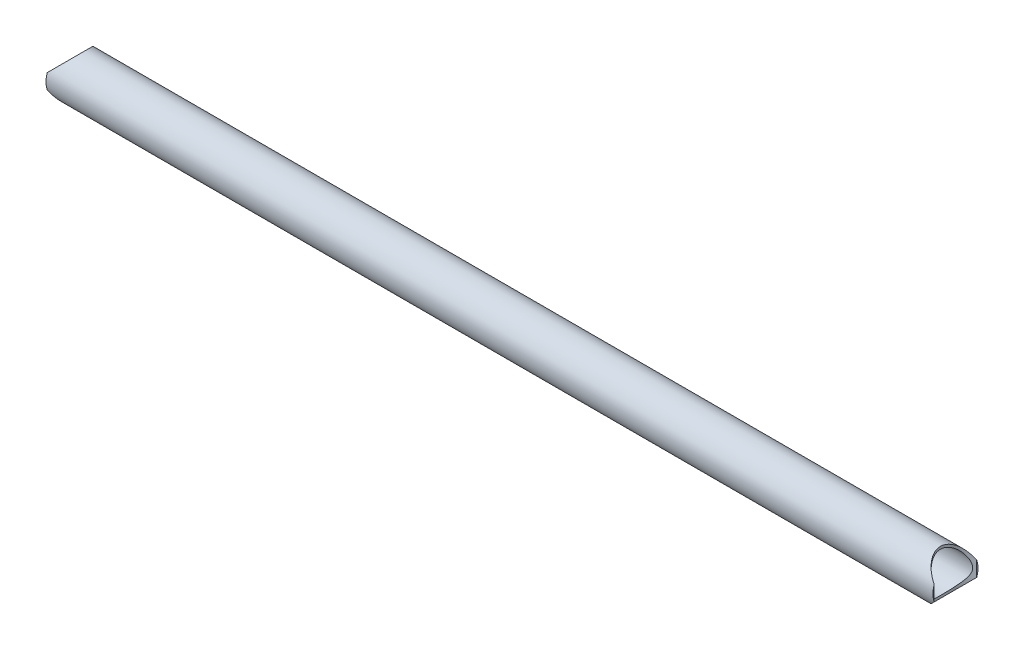
ISO-10303-21;
HEADER;
FILE_DESCRIPTION(('STEP AP214'),'2;1');
FILE_NAME('part.step','',(''),(''),'','','');
FILE_SCHEMA(('AUTOMOTIVE_DESIGN { 1 0 10303 214 1 1 1 1 }'));
ENDSEC;
DATA;
#1=APPLICATION_CONTEXT('core data for automotive mechanical design processes');
#2=APPLICATION_PROTOCOL_DEFINITION('international standard','automotive_design',2000,#1);
#3=PRODUCT_CONTEXT('',#1,'mechanical');
#4=PRODUCT('Part','Part','',(#3));
#5=PRODUCT_RELATED_PRODUCT_CATEGORY('part','',(#4));
#6=PRODUCT_DEFINITION_FORMATION('','',#4);
#7=PRODUCT_DEFINITION_CONTEXT('part definition',#1,'design');
#8=PRODUCT_DEFINITION('design','',#6,#7);
#9=PRODUCT_DEFINITION_SHAPE('','',#8);
#10=(LENGTH_UNIT() NAMED_UNIT(*) SI_UNIT(.MILLI.,.METRE.));
#11=(NAMED_UNIT(*) PLANE_ANGLE_UNIT() SI_UNIT($,.RADIAN.));
#12=(NAMED_UNIT(*) SI_UNIT($,.STERADIAN.) SOLID_ANGLE_UNIT());
#13=UNCERTAINTY_MEASURE_WITH_UNIT(LENGTH_MEASURE(1.E-05),#10,'distance_accuracy_value','');
#14=(GEOMETRIC_REPRESENTATION_CONTEXT(3) GLOBAL_UNCERTAINTY_ASSIGNED_CONTEXT((#13)) GLOBAL_UNIT_ASSIGNED_CONTEXT((#10,
#11,#12)) REPRESENTATION_CONTEXT('',''));
#15=CARTESIAN_POINT('',(0.,0.,0.));
#16=DIRECTION('',(0.,0.,1.));
#17=DIRECTION('',(1.,0.,0.));
#18=AXIS2_PLACEMENT_3D('',#15,#16,#17);
#19=CARTESIAN_POINT('',(374.65,0.,0.));
#20=DIRECTION('',(1.,0.,0.));
#21=DIRECTION('',(0.,0.,-1.));
#22=AXIS2_PLACEMENT_3D('',#19,#20,#21);
#23=PLANE('',#22);
#24=CARTESIAN_POINT('',(374.65,0.,0.));
#25=DIRECTION('',(1.,0.,0.));
#26=DIRECTION('',(0.,0.,-1.));
#27=AXIS2_PLACEMENT_3D('',#24,#25,#26);
#28=CIRCLE('',#27,19.05);
#29=CARTESIAN_POINT('',(374.65,-6.35000000000021,17.9605122421382));
#30=VERTEX_POINT('',#29);
#31=CARTESIAN_POINT('',(374.65,6.3500000000002,17.9605122421382));
#32=VERTEX_POINT('',#31);
#33=EDGE_CURVE('E67',#30,#32,#28,.F.);
#34=ORIENTED_EDGE('',*,*,#33,.F.);
#35=DIRECTION('',(0.,1.,0.));
#36=VECTOR('',#35,1.);
#37=CARTESIAN_POINT('',(374.65,-93.9038,17.9605122421382));
#38=LINE('',#37,#36);
#39=EDGE_CURVE('E72',#30,#32,#38,.T.);
#40=ORIENTED_EDGE('',*,*,#39,.T.);
#41=EDGE_LOOP('',(#34,#40));
#42=FACE_BOUND('',#41,.T.);
#43=ADVANCED_FACE('F16',(#42),#23,.T.);
#44=CARTESIAN_POINT('',(-374.65,0.,0.));
#45=DIRECTION('',(1.,0.,0.));
#46=DIRECTION('',(0.,0.,-1.));
#47=AXIS2_PLACEMENT_3D('',#44,#45,#46);
#48=PLANE('',#47);
#49=DIRECTION('',(0.,1.,0.));
#50=VECTOR('',#49,1.);
#51=CARTESIAN_POINT('',(-374.65,-93.9038,17.9605122421382));
#52=LINE('',#51,#50);
#53=CARTESIAN_POINT('',(-374.65,6.3500000000002,17.9605122421382));
#54=VERTEX_POINT('',#53);
#55=CARTESIAN_POINT('',(-374.65,-6.35000000000021,17.9605122421382));
#56=VERTEX_POINT('',#55);
#57=EDGE_CURVE('E79',#54,#56,#52,.F.);
#58=ORIENTED_EDGE('',*,*,#57,.T.);
#59=CARTESIAN_POINT('',(-374.65,0.,0.));
#60=DIRECTION('',(1.,0.,0.));
#61=DIRECTION('',(0.,0.,-1.));
#62=AXIS2_PLACEMENT_3D('',#59,#60,#61);
#63=CIRCLE('',#62,19.05);
#64=EDGE_CURVE('E77',#54,#56,#63,.T.);
#65=ORIENTED_EDGE('',*,*,#64,.F.);
#66=EDGE_LOOP('',(#58,#65));
#67=FACE_BOUND('',#66,.T.);
#68=ADVANCED_FACE('F111',(#67),#48,.F.);
#69=CARTESIAN_POINT('',(-374.65,0.,0.));
#70=DIRECTION('',(1.,0.,0.));
#71=DIRECTION('',(0.,0.,-1.));
#72=AXIS2_PLACEMENT_3D('',#69,#70,#71);
#73=CYLINDRICAL_SURFACE('',#72,16.9418);
#74=CARTESIAN_POINT('',(361.95,16.9418,0.));
#75=CARTESIAN_POINT('',(361.95000374405,16.9417961923884,0.394184193497354));
#76=CARTESIAN_POINT('',(361.962262153139,16.9280155894072,0.788435535775758));
#77=CARTESIAN_POINT('',(362.011024211929,16.8731574498692,1.57356577010718));
#78=CARTESIAN_POINT('',(362.047533436322,16.8320736369451,1.96444386579684));
#79=CARTESIAN_POINT('',(362.144014592432,16.7233639167852,2.73991152674503));
#80=CARTESIAN_POINT('',(362.204008108813,16.6557135918004,3.12449496676739));
#81=CARTESIAN_POINT('',(362.346166269736,16.4951203047581,3.88411123711812));
#82=CARTESIAN_POINT('',(362.428330169879,16.4021781919052,4.25914438764759));
#83=CARTESIAN_POINT('',(362.612598152288,16.1932406328883,4.99488319536369));
#84=CARTESIAN_POINT('',(362.714569298355,16.0773987911132,5.35566607021391));
#85=CARTESIAN_POINT('',(362.93697357334,15.8239912188579,6.06360117385423));
#86=CARTESIAN_POINT('',(363.057406460062,15.6864257733653,6.41075358138511));
#87=CARTESIAN_POINT('',(363.314834278465,15.3913086823074,7.09008972801091));
#88=CARTESIAN_POINT('',(363.451830369669,15.2337556374548,7.42227241690055));
#89=CARTESIAN_POINT('',(363.740464241844,14.900356318422,8.07074683742287));
#90=CARTESIAN_POINT('',(363.892105284976,14.7245059678419,8.38703500458891));
#91=CARTESIAN_POINT('',(364.270217204701,14.2837373054012,9.12410505100004));
#92=CARTESIAN_POINT('',(364.502687093087,14.0109622384892,9.53714057189234));
#93=CARTESIAN_POINT('',(364.987460743635,13.4367851491423,10.3304086586787));
#94=CARTESIAN_POINT('',(365.239771716018,13.1353727115659,10.7106291933897));
#95=CARTESIAN_POINT('',(365.760097116028,12.5063214936942,11.4389050770027));
#96=CARTESIAN_POINT('',(366.028144951756,12.1786263348985,11.7868876327892));
#97=CARTESIAN_POINT('',(366.574845762738,11.499897771744,12.4499819069018));
#98=CARTESIAN_POINT('',(366.853497327648,11.1488674664611,12.7650979759111));
#99=CARTESIAN_POINT('',(367.423194169387,10.4166191913228,13.3697111612045));
#100=CARTESIAN_POINT('',(367.714377220476,10.034898304148,13.6584684285955));
#101=CARTESIAN_POINT('',(368.297673625015,9.24882151979437,14.2025527079429));
#102=CARTESIAN_POINT('',(368.589787225436,8.84445904128633,14.4578699269681));
#103=CARTESIAN_POINT('',(369.167840094133,8.01320927376596,14.9346013590283));
#104=CARTESIAN_POINT('',(369.453789755916,7.58636490171244,15.1560772296062));
#105=CARTESIAN_POINT('',(369.871695004004,6.92746866843015,15.4626419512512));
#106=CARTESIAN_POINT('',(370.009134561576,6.70477675080935,15.5605388024915));
#107=CARTESIAN_POINT('',(370.278904063937,6.25275448249375,15.7476188132693));
#108=CARTESIAN_POINT('',(370.411234784508,6.02342514902508,15.8368032989616));
#109=CARTESIAN_POINT('',(370.670396494113,5.5552838813426,16.0070634993151));
#110=CARTESIAN_POINT('',(370.797156460578,5.31639841182006,16.088045825461));
#111=CARTESIAN_POINT('',(371.041456023067,4.83100990439236,16.2404006796485));
#112=CARTESIAN_POINT('',(371.158997959897,4.58450882268691,16.3117756506805));
#113=CARTESIAN_POINT('',(371.382080889626,4.0837067582187,16.4442984069774));
#114=CARTESIAN_POINT('',(371.487633328698,3.82941351414151,16.5054559733479));
#115=CARTESIAN_POINT('',(371.683627012263,3.31270004661861,16.6168712827558));
#116=CARTESIAN_POINT('',(371.774070755538,3.05028117557337,16.6671308285956));
#117=CARTESIAN_POINT('',(371.922853996104,2.56155126793315,16.7485490492217));
#118=CARTESIAN_POINT('',(371.984027358225,2.33640475862087,16.7814899418482));
#119=CARTESIAN_POINT('',(372.091080238411,1.88142840856821,16.8385670532647));
#120=CARTESIAN_POINT('',(372.136964442065,1.65160002561208,16.8627059697651));
#121=CARTESIAN_POINT('',(372.21142642816,1.18876159210726,16.9016346143041));
#122=CARTESIAN_POINT('',(372.240035117052,0.955757990655739,16.9164410405595));
#123=CARTESIAN_POINT('',(372.278675593239,0.487787683136439,16.9363952490215));
#124=CARTESIAN_POINT('',(372.288708023371,0.252821045282712,16.9415433654564));
#125=CARTESIAN_POINT('',(372.289671046546,-0.217818078177454,16.9420385610885));
#126=CARTESIAN_POINT('',(372.280548328064,-0.453490706010506,16.9373582864601));
#127=CARTESIAN_POINT('',(372.243575971063,-0.922946866189646,16.9182729817827));
#128=CARTESIAN_POINT('',(372.215725790753,-1.15673034368407,16.9038676703857));
#129=CARTESIAN_POINT('',(372.14261073801,-1.62115360877379,16.8656705247631));
#130=CARTESIAN_POINT('',(372.097316267991,-1.85178735983582,16.8418627356726));
#131=CARTESIAN_POINT('',(371.991268999413,-2.30839613187293,16.7853765549414));
#132=CARTESIAN_POINT('',(371.930510348983,-2.53436935416419,16.7526948049513));
#133=CARTESIAN_POINT('',(371.761317887817,-3.09495879054535,16.6602122327194));
#134=CARTESIAN_POINT('',(371.644381527947,-3.42613532293252,16.5950848859265));
#135=CARTESIAN_POINT('',(371.387584269334,-4.07550920863544,16.4476704242981));
#136=CARTESIAN_POINT('',(371.247709104086,-4.39369832980277,16.3653726217851));
#137=CARTESIAN_POINT('',(370.950719694187,-5.01855813637689,16.1847084588516));
#138=CARTESIAN_POINT('',(370.793546861256,-5.3251846390518,16.0862869000012));
#139=CARTESIAN_POINT('',(370.467258231689,-5.92659541327603,15.8745609394275));
#140=CARTESIAN_POINT('',(370.298143533768,-6.22138077036855,15.7612579060561));
#141=CARTESIAN_POINT('',(369.973468669035,-6.76368935777244,15.5355128442468));
#142=CARTESIAN_POINT('',(369.818874817248,-7.01249751499679,15.4247509464399));
#143=CARTESIAN_POINT('',(369.505349492994,-7.50229328838969,15.1925513006733));
#144=CARTESIAN_POINT('',(369.346417447248,-7.74327986165947,15.0711121369911));
#145=CARTESIAN_POINT('',(368.865443368151,-8.455337142821,14.6908757746472));
#146=CARTESIAN_POINT('',(368.539334858792,-8.91532399132137,14.4162357153203));
#147=CARTESIAN_POINT('',(367.886691494802,-9.80676129687197,13.8252563067096));
#148=CARTESIAN_POINT('',(367.560156916591,-10.2382252174247,13.508936845222));
#149=CARTESIAN_POINT('',(366.91432323517,-11.0723963580602,12.8341031687215));
#150=CARTESIAN_POINT('',(366.595021008555,-11.4751161598644,12.4756075990565));
#151=CARTESIAN_POINT('',(366.029484484933,-12.1767333021638,11.7875104078084));
#152=CARTESIAN_POINT('',(365.780835679443,-12.4808781654303,11.4652302076634));
#153=CARTESIAN_POINT('',(365.296387585142,-13.0672425088248,10.7921703362535));
#154=CARTESIAN_POINT('',(365.060588584201,-13.3494614978141,10.4413900269469));
#155=CARTESIAN_POINT('',(364.605918358068,-13.8891714046938,9.71190317795474));
#156=CARTESIAN_POINT('',(364.387023484663,-14.146696994291,9.33323715426072));
#157=CARTESIAN_POINT('',(363.969721476738,-14.6344940609238,8.54807684872159));
#158=CARTESIAN_POINT('',(363.771308974995,-14.8647726801095,8.14158990376797));
#159=CARTESIAN_POINT('',(363.438182123013,-15.2494827529787,7.39030570283803));
#160=CARTESIAN_POINT('',(363.298845147345,-15.4096825772221,7.05050184258114));
#161=CARTESIAN_POINT('',(363.037548692147,-15.7091405581432,6.35536238395082));
#162=CARTESIAN_POINT('',(362.915585484047,-15.8484032084881,6.00003013956725));
#163=CARTESIAN_POINT('',(362.691184083557,-16.1039921676819,5.27573053950246));
#164=CARTESIAN_POINT('',(362.588722110629,-16.2203464179418,4.90678045432039));
#165=CARTESIAN_POINT('',(362.405060307867,-16.4285201572901,4.15687556096404));
#166=CARTESIAN_POINT('',(362.323855421012,-16.5203454818711,3.77592363221096));
#167=CARTESIAN_POINT('',(362.204213596944,-16.6554600945729,3.11441535552881));
#168=CARTESIAN_POINT('',(362.160182409363,-16.7051249938061,2.83614726285123));
#169=CARTESIAN_POINT('',(362.084322860884,-16.7906319202838,2.2758599476137));
#170=CARTESIAN_POINT('',(362.052493065463,-16.8264755725,1.99384117005953));
#171=CARTESIAN_POINT('',(362.00140252241,-16.8839855488843,1.4271469838388));
#172=CARTESIAN_POINT('',(361.982145187254,-16.9056480239346,1.14247087515576));
#173=CARTESIAN_POINT('',(361.956443660979,-16.9345554007589,0.57187480977205));
#174=CARTESIAN_POINT('',(361.949997283934,-16.9418027621753,0.285955073616253));
#175=CARTESIAN_POINT('',(361.95000374405,-16.9417961923884,-0.394184193497359));
#176=CARTESIAN_POINT('',(361.962262153139,-16.9280155894072,-0.788435535775761));
#177=CARTESIAN_POINT('',(362.011024211929,-16.8731574498692,-1.57356577010718));
#178=CARTESIAN_POINT('',(362.047533436322,-16.8320736369451,-1.96444386579685));
#179=CARTESIAN_POINT('',(362.144014592432,-16.7233639167852,-2.73991152674503));
#180=CARTESIAN_POINT('',(362.204008108813,-16.6557135918004,-3.1244949667674));
#181=CARTESIAN_POINT('',(362.346166269736,-16.4951203047581,-3.88411123711813));
#182=CARTESIAN_POINT('',(362.428330169879,-16.4021781919052,-4.25914438764759));
#183=CARTESIAN_POINT('',(362.612598152288,-16.1932406328883,-4.9948831953637));
#184=CARTESIAN_POINT('',(362.714569298355,-16.0773987911132,-5.35566607021392));
#185=CARTESIAN_POINT('',(362.93697357334,-15.8239912188579,-6.06360117385424));
#186=CARTESIAN_POINT('',(363.057406460062,-15.6864257733653,-6.41075358138512));
#187=CARTESIAN_POINT('',(363.314834278465,-15.3913086823074,-7.09008972801092));
#188=CARTESIAN_POINT('',(363.451830369669,-15.2337556374548,-7.42227241690056));
#189=CARTESIAN_POINT('',(363.740464241844,-14.9003563184219,-8.07074683742288));
#190=CARTESIAN_POINT('',(363.892105284976,-14.7245059678419,-8.38703500458892));
#191=CARTESIAN_POINT('',(364.270217204701,-14.2837373054012,-9.12410505100005));
#192=CARTESIAN_POINT('',(364.502687093087,-14.0109622384892,-9.53714057189236));
#193=CARTESIAN_POINT('',(364.987460743635,-13.4367851491422,-10.3304086586787));
#194=CARTESIAN_POINT('',(365.239771716018,-13.1353727115659,-10.7106291933897));
#195=CARTESIAN_POINT('',(365.760097116028,-12.5063214936942,-11.4389050770027));
#196=CARTESIAN_POINT('',(366.028144951756,-12.1786263348985,-11.7868876327893));
#197=CARTESIAN_POINT('',(366.574845762738,-11.499897771744,-12.4499819069018));
#198=CARTESIAN_POINT('',(366.853497327648,-11.1488674664611,-12.7650979759111));
#199=CARTESIAN_POINT('',(367.423194169387,-10.4166191913228,-13.3697111612046));
#200=CARTESIAN_POINT('',(367.714377220476,-10.034898304148,-13.6584684285955));
#201=CARTESIAN_POINT('',(368.297673625015,-9.24882151979436,-14.2025527079429));
#202=CARTESIAN_POINT('',(368.589787225436,-8.84445904128632,-14.4578699269681));
#203=CARTESIAN_POINT('',(369.167840094133,-8.01320927376595,-14.9346013590283));
#204=CARTESIAN_POINT('',(369.453789755916,-7.58636490171244,-15.1560772296062));
#205=CARTESIAN_POINT('',(369.871695004004,-6.92746866843014,-15.4626419512512));
#206=CARTESIAN_POINT('',(370.009134561576,-6.70477675080934,-15.5605388024915));
#207=CARTESIAN_POINT('',(370.278904063937,-6.25275448249373,-15.7476188132693));
#208=CARTESIAN_POINT('',(370.411234784508,-6.02342514902506,-15.8368032989616));
#209=CARTESIAN_POINT('',(370.670396494113,-5.55528388134259,-16.0070634993152));
#210=CARTESIAN_POINT('',(370.797156460578,-5.31639841182005,-16.088045825461));
#211=CARTESIAN_POINT('',(371.041456023067,-4.83100990439235,-16.2404006796486));
#212=CARTESIAN_POINT('',(371.158997959897,-4.58450882268689,-16.3117756506805));
#213=CARTESIAN_POINT('',(371.382080889626,-4.08370675821868,-16.4442984069774));
#214=CARTESIAN_POINT('',(371.487633328698,-3.8294135141415,-16.5054559733479));
#215=CARTESIAN_POINT('',(371.683627012263,-3.31270004661861,-16.6168712827558));
#216=CARTESIAN_POINT('',(371.774070755538,-3.05028117557335,-16.6671308285956));
#217=CARTESIAN_POINT('',(371.922853996104,-2.56155126793313,-16.7485490492217));
#218=CARTESIAN_POINT('',(371.984027358225,-2.33640475862086,-16.7814899418482));
#219=CARTESIAN_POINT('',(372.091080238411,-1.8814284085682,-16.8385670532647));
#220=CARTESIAN_POINT('',(372.136964442065,-1.65160002561207,-16.8627059697651));
#221=CARTESIAN_POINT('',(372.21142642816,-1.18876159210724,-16.9016346143041));
#222=CARTESIAN_POINT('',(372.240035117052,-0.955757990655716,-16.9164410405595));
#223=CARTESIAN_POINT('',(372.278675593239,-0.487787683136415,-16.9363952490215));
#224=CARTESIAN_POINT('',(372.288708023371,-0.252821045282685,-16.9415433654564));
#225=CARTESIAN_POINT('',(372.289671046546,0.217818078177484,-16.9420385610885));
#226=CARTESIAN_POINT('',(372.280548328064,0.453490706010536,-16.9373582864601));
#227=CARTESIAN_POINT('',(372.243575971063,0.922946866189676,-16.9182729817827));
#228=CARTESIAN_POINT('',(372.215725790753,1.1567303436841,-16.9038676703857));
#229=CARTESIAN_POINT('',(372.14261073801,1.62115360877382,-16.8656705247631));
#230=CARTESIAN_POINT('',(372.097316267991,1.85178735983585,-16.8418627356726));
#231=CARTESIAN_POINT('',(371.991268999413,2.30839613187296,-16.7853765549414));
#232=CARTESIAN_POINT('',(371.930510348983,2.53436935416423,-16.7526948049513));
#233=CARTESIAN_POINT('',(371.761317887817,3.0949587905454,-16.6602122327194));
#234=CARTESIAN_POINT('',(371.644381527947,3.42613532293257,-16.5950848859265));
#235=CARTESIAN_POINT('',(371.387584269334,4.07550920863552,-16.4476704242981));
#236=CARTESIAN_POINT('',(371.247709104086,4.39369832980287,-16.3653726217851));
#237=CARTESIAN_POINT('',(370.950719694186,5.01855813637699,-16.1847084588515));
#238=CARTESIAN_POINT('',(370.793546861256,5.32518463905188,-16.0862869000011));
#239=CARTESIAN_POINT('',(370.467258231689,5.92659541327609,-15.8745609394275));
#240=CARTESIAN_POINT('',(370.298143533768,6.22138077036862,-15.7612579060561));
#241=CARTESIAN_POINT('',(369.973468669035,6.76368935777248,-15.5355128442468));
#242=CARTESIAN_POINT('',(369.818874817248,7.0124975149968,-15.4247509464399));
#243=CARTESIAN_POINT('',(369.505349492994,7.50229328838967,-15.1925513006733));
#244=CARTESIAN_POINT('',(369.346417447248,7.74327986165946,-15.0711121369911));
#245=CARTESIAN_POINT('',(368.865443368151,8.45533714282102,-14.6908757746471));
#246=CARTESIAN_POINT('',(368.539334858792,8.9153239913214,-14.4162357153203));
#247=CARTESIAN_POINT('',(367.886691494802,9.806761296872,-13.8252563067096));
#248=CARTESIAN_POINT('',(367.560156916591,10.2382252174247,-13.5089368452219));
#249=CARTESIAN_POINT('',(366.91432323517,11.0723963580602,-12.8341031687215));
#250=CARTESIAN_POINT('',(366.595021008555,11.4751161598644,-12.4756075990565));
#251=CARTESIAN_POINT('',(366.029484484933,12.1767333021638,-11.7875104078084));
#252=CARTESIAN_POINT('',(365.780835679443,12.4808781654303,-11.4652302076634));
#253=CARTESIAN_POINT('',(365.296387585142,13.0672425088248,-10.7921703362535));
#254=CARTESIAN_POINT('',(365.060588584201,13.3494614978141,-10.4413900269469));
#255=CARTESIAN_POINT('',(364.605918358068,13.8891714046938,-9.71190317795473));
#256=CARTESIAN_POINT('',(364.387023484663,14.146696994291,-9.33323715426072));
#257=CARTESIAN_POINT('',(363.969721476738,14.6344940609238,-8.54807684872159));
#258=CARTESIAN_POINT('',(363.771308974995,14.8647726801095,-8.14158990376797));
#259=CARTESIAN_POINT('',(363.438182123013,15.2494827529787,-7.39030570283803));
#260=CARTESIAN_POINT('',(363.298845147345,15.4096825772221,-7.05050184258115));
#261=CARTESIAN_POINT('',(363.037548692147,15.7091405581432,-6.35536238395083));
#262=CARTESIAN_POINT('',(362.915585484047,15.8484032084881,-6.00003013956726));
#263=CARTESIAN_POINT('',(362.691184083557,16.1039921676819,-5.27573053950248));
#264=CARTESIAN_POINT('',(362.588722110629,16.2203464179418,-4.9067804543204));
#265=CARTESIAN_POINT('',(362.405060307867,16.4285201572901,-4.15687556096405));
#266=CARTESIAN_POINT('',(362.323855421012,16.5203454818711,-3.77592363221097));
#267=CARTESIAN_POINT('',(362.204213596944,16.6554600945729,-3.11441535552881));
#268=CARTESIAN_POINT('',(362.160182409363,16.7051249938061,-2.83614726285123));
#269=CARTESIAN_POINT('',(362.084322860884,16.7906319202838,-2.2758599476137));
#270=CARTESIAN_POINT('',(362.052493065463,16.8264755725,-1.99384117005953));
#271=CARTESIAN_POINT('',(362.00140252241,16.8839855488843,-1.4271469838388));
#272=CARTESIAN_POINT('',(361.982145187254,16.9056480239346,-1.14247087515575));
#273=CARTESIAN_POINT('',(361.956443660979,16.9345554007589,-0.57187480977205));
#274=CARTESIAN_POINT('',(361.949997283934,16.9418027621753,-0.285955073616256));
#275=CARTESIAN_POINT('',(361.95,16.9418,0.));
#276=B_SPLINE_CURVE_WITH_KNOTS('',3,(#74,#75,#76,#77,#78,#79,#80,#81,#82,#83,#84,#85,#86,#87,
#88,#89,#90,#91,#92,#93,#94,#95,#96,#97,#98,#99,#100,#101,#102,#103,#104,#105,#106,#107,#108,
#109,#110,#111,#112,#113,#114,#115,#116,#117,#118,#119,#120,#121,#122,#123,#124,#125,#126,#127,
#128,#129,#130,#131,#132,#133,#134,#135,#136,#137,#138,#139,#140,#141,#142,#143,#144,#145,#146,
#147,#148,#149,#150,#151,#152,#153,#154,#155,#156,#157,#158,#159,#160,#161,#162,#163,#164,#165,
#166,#167,#168,#169,#170,#171,#172,#173,#174,#175,#176,#177,#178,#179,#180,#181,#182,#183,#184,
#185,#186,#187,#188,#189,#190,#191,#192,#193,#194,#195,#196,#197,#198,#199,#200,#201,#202,#203,
#204,#205,#206,#207,#208,#209,#210,#211,#212,#213,#214,#215,#216,#217,#218,#219,#220,#221,#222,
#223,#224,#225,#226,#227,#228,#229,#230,#231,#232,#233,#234,#235,#236,#237,#238,#239,#240,#241,
#242,#243,#244,#245,#246,#247,#248,#249,#250,#251,#252,#253,#254,#255,#256,#257,#258,#259,#260,
#261,#262,#263,#264,#265,#266,#267,#268,#269,#270,#271,#272,#273,#274,#275),.UNSPECIFIED.,.T.,
.F.,(4,2,2,2,2,2,2,2,2,2,2,2,2,2,2,2,2,2,2,2,2,2,2,2,2,2,2,2,2,2,2,2,2,2,2,2,2,2,2,2,2,2,2,2,2,
2,2,2,2,2,2,2,2,2,2,2,2,2,2,2,2,2,2,2,2,2,2,2,2,2,2,2,2,2,2,2,2,2,2,2,2,2,2,2,2,2,2,2,2,2,2,2,2,
2,2,2,2,2,2,2,4),(0.,1.182242256413,2.36475637661828,3.54835991978546,4.73192372682959,
5.90780261774796,7.08366608382876,8.25961191496233,9.43582029464445,11.0739682017032,
12.7127141850546,14.3550745833379,15.997217298389,17.6764688085164,19.3562109937498,
21.0328552979582,21.8708516620749,22.7087202709684,23.5552531660917,24.4015703937179,
25.2470727422877,26.092435116949,26.7986824529679,27.5047131495125,28.2094769630755,
28.9142163876493,29.6209198025279,30.3276436634078,31.0355719374648,31.7437685012011,
32.8135631624544,33.8840257101522,34.9582325707477,36.0323407270625,36.9715067853865,
37.9107975581714,39.7900551537561,41.6684192659187,43.5459560833924,45.0690515735913,
46.592181171246,48.1131398453261,49.6336989485931,50.8346318927197,52.0353067160249,
53.234507876433,54.4334234892966,55.2910781673585,56.148631979721,57.0064184567369,
57.8640585575876,59.0463008140006,60.2288149342059,61.4124184773731,62.5959822844172,
63.7718611753356,64.9477246414164,66.12367047255,67.2998788522321,68.9380267592908,
70.5767727426422,72.2191331409255,73.8612758559766,75.540527366104,77.2202695513374,
78.8969138555458,79.7349102196626,80.572778828556,81.4193117236794,82.2656289513056,
83.1111312998754,83.9564936745367,84.6627410105555,85.3687717071002,86.0735355206631,
86.7782749452369,87.4849783601155,88.1917022209954,88.8996304950525,89.6078270587887,
90.6776217200421,91.74808426774,92.8222911283355,93.8963992846502,94.8355653429742,
95.7748561157591,97.6541137113438,99.5324778235064,101.41001464098,102.933110131179,
104.456239728834,105.977198402914,107.497757506181,108.698690450307,109.899365273613,
111.098566434021,112.297482046884,113.155136724946,114.012690537309,114.870477014325,
115.728117115175),.UNSPECIFIED.);
#277=CARTESIAN_POINT('',(361.95,16.9418,0.));
#278=VERTEX_POINT('',#277);
#279=EDGE_CURVE('E19',#278,#278,#276,.T.);
#280=ORIENTED_EDGE('',*,*,#279,.T.);
#281=EDGE_LOOP('',(#280));
#282=FACE_BOUND('',#281,.T.);
#283=CARTESIAN_POINT('',(-361.95,-16.9418,0.));
#284=CARTESIAN_POINT('',(-361.95000374405,-16.9417961923884,0.394184193497358));
#285=CARTESIAN_POINT('',(-361.962262153139,-16.9280155894072,0.788435535775762));
#286=CARTESIAN_POINT('',(-362.011024211929,-16.8731574498692,1.57356577010719));
#287=CARTESIAN_POINT('',(-362.047533436322,-16.8320736369451,1.96444386579685));
#288=CARTESIAN_POINT('',(-362.144014592432,-16.7233639167852,2.73991152674503));
#289=CARTESIAN_POINT('',(-362.204008108813,-16.6557135918004,3.1244949667674));
#290=CARTESIAN_POINT('',(-362.346166269736,-16.4951203047581,3.88411123711813));
#291=CARTESIAN_POINT('',(-362.428330169879,-16.4021781919052,4.25914438764759));
#292=CARTESIAN_POINT('',(-362.612598152288,-16.1932406328883,4.9948831953637));
#293=CARTESIAN_POINT('',(-362.714569298355,-16.0773987911132,5.35566607021392));
#294=CARTESIAN_POINT('',(-362.93697357334,-15.8239912188579,6.06360117385424));
#295=CARTESIAN_POINT('',(-363.057406460062,-15.6864257733653,6.41075358138512));
#296=CARTESIAN_POINT('',(-363.314834278465,-15.3913086823074,7.09008972801093));
#297=CARTESIAN_POINT('',(-363.451830369669,-15.2337556374548,7.42227241690059));
#298=CARTESIAN_POINT('',(-363.740464241844,-14.9003563184219,8.07074683742291));
#299=CARTESIAN_POINT('',(-363.892105284976,-14.7245059678419,8.38703500458893));
#300=CARTESIAN_POINT('',(-364.270217204701,-14.2837373054012,9.12410505100006));
#301=CARTESIAN_POINT('',(-364.502687093087,-14.0109622384892,9.53714057189237));
#302=CARTESIAN_POINT('',(-364.987460743635,-13.4367851491422,10.3304086586787));
#303=CARTESIAN_POINT('',(-365.239771716018,-13.1353727115659,10.7106291933897));
#304=CARTESIAN_POINT('',(-365.760097116028,-12.5063214936942,11.4389050770027));
#305=CARTESIAN_POINT('',(-366.028144951756,-12.1786263348985,11.7868876327893));
#306=CARTESIAN_POINT('',(-366.574845762738,-11.499897771744,12.4499819069018));
#307=CARTESIAN_POINT('',(-366.853497327648,-11.1488674664611,12.7650979759111));
#308=CARTESIAN_POINT('',(-367.423194169387,-10.4166191913228,13.3697111612045));
#309=CARTESIAN_POINT('',(-367.714377220476,-10.034898304148,13.6584684285955));
#310=CARTESIAN_POINT('',(-368.297673625015,-9.24882151979437,14.2025527079429));
#311=CARTESIAN_POINT('',(-368.589787225436,-8.84445904128633,14.4578699269681));
#312=CARTESIAN_POINT('',(-369.167840094133,-8.01320927376596,14.9346013590283));
#313=CARTESIAN_POINT('',(-369.453789755916,-7.58636490171246,15.1560772296061));
#314=CARTESIAN_POINT('',(-369.871695004004,-6.92746866843018,15.4626419512512));
#315=CARTESIAN_POINT('',(-370.009134561576,-6.70477675080939,15.5605388024915));
#316=CARTESIAN_POINT('',(-370.278904063937,-6.25275448249377,15.7476188132693));
#317=CARTESIAN_POINT('',(-370.411234784508,-6.02342514902508,15.8368032989616));
#318=CARTESIAN_POINT('',(-370.670396494113,-5.55528388134259,16.0070634993151));
#319=CARTESIAN_POINT('',(-370.797156460578,-5.31639841182005,16.088045825461));
#320=CARTESIAN_POINT('',(-371.041456023067,-4.83100990439235,16.2404006796485));
#321=CARTESIAN_POINT('',(-371.158997959897,-4.58450882268689,16.3117756506805));
#322=CARTESIAN_POINT('',(-371.382080889626,-4.08370675821868,16.4442984069774));
#323=CARTESIAN_POINT('',(-371.487633328698,-3.8294135141415,16.5054559733479));
#324=CARTESIAN_POINT('',(-371.683627012263,-3.3127000466186,16.6168712827558));
#325=CARTESIAN_POINT('',(-371.774070755538,-3.05028117557334,16.6671308285956));
#326=CARTESIAN_POINT('',(-371.922853996104,-2.56155126793312,16.7485490492217));
#327=CARTESIAN_POINT('',(-371.984027358225,-2.33640475862084,16.7814899418482));
#328=CARTESIAN_POINT('',(-372.091080238411,-1.88142840856818,16.8385670532647));
#329=CARTESIAN_POINT('',(-372.136964442065,-1.65160002561206,16.8627059697651));
#330=CARTESIAN_POINT('',(-372.21142642816,-1.18876159210724,16.9016346143041));
#331=CARTESIAN_POINT('',(-372.240035117052,-0.955757990655714,16.9164410405595));
#332=CARTESIAN_POINT('',(-372.278675593239,-0.487787683136412,16.9363952490215));
#333=CARTESIAN_POINT('',(-372.288708023371,-0.252821045282682,16.9415433654564));
#334=CARTESIAN_POINT('',(-372.289671046546,0.217818078177487,16.9420385610885));
#335=CARTESIAN_POINT('',(-372.280548328064,0.45349070601054,16.9373582864601));
#336=CARTESIAN_POINT('',(-372.243575971063,0.922946866189681,16.9182729817827));
#337=CARTESIAN_POINT('',(-372.215725790753,1.15673034368411,16.9038676703857));
#338=CARTESIAN_POINT('',(-372.14261073801,1.62115360877383,16.8656705247631));
#339=CARTESIAN_POINT('',(-372.097316267991,1.85178735983585,16.8418627356726));
#340=CARTESIAN_POINT('',(-371.991268999413,2.30839613187296,16.7853765549414));
#341=CARTESIAN_POINT('',(-371.930510348983,2.53436935416423,16.7526948049513));
#342=CARTESIAN_POINT('',(-371.761317887817,3.0949587905454,16.6602122327194));
#343=CARTESIAN_POINT('',(-371.644381527947,3.42613532293257,16.5950848859265));
#344=CARTESIAN_POINT('',(-371.387584269334,4.07550920863552,16.4476704242981));
#345=CARTESIAN_POINT('',(-371.247709104086,4.39369832980286,16.3653726217851));
#346=CARTESIAN_POINT('',(-370.950719694186,5.01855813637698,16.1847084588515));
#347=CARTESIAN_POINT('',(-370.793546861256,5.32518463905187,16.0862869000011));
#348=CARTESIAN_POINT('',(-370.467258231689,5.92659541327609,15.8745609394275));
#349=CARTESIAN_POINT('',(-370.298143533768,6.22138077036862,15.7612579060561));
#350=CARTESIAN_POINT('',(-369.973468669035,6.76368935777249,15.5355128442468));
#351=CARTESIAN_POINT('',(-369.818874817248,7.01249751499682,15.4247509464399));
#352=CARTESIAN_POINT('',(-369.505349492994,7.50229328838969,15.1925513006733));
#353=CARTESIAN_POINT('',(-369.346417447248,7.74327986165947,15.0711121369911));
#354=CARTESIAN_POINT('',(-368.865443368151,8.45533714282103,14.6908757746471));
#355=CARTESIAN_POINT('',(-368.539334858791,8.9153239913214,14.4162357153203));
#356=CARTESIAN_POINT('',(-367.886691494802,9.80676129687201,13.8252563067096));
#357=CARTESIAN_POINT('',(-367.560156916591,10.2382252174247,13.5089368452219));
#358=CARTESIAN_POINT('',(-366.91432323517,11.0723963580603,12.8341031687214));
#359=CARTESIAN_POINT('',(-366.595021008555,11.4751161598644,12.4756075990565));
#360=CARTESIAN_POINT('',(-366.029484484933,12.1767333021639,11.7875104078083));
#361=CARTESIAN_POINT('',(-365.780835679443,12.4808781654303,11.4652302076633));
#362=CARTESIAN_POINT('',(-365.296387585142,13.0672425088249,10.7921703362534));
#363=CARTESIAN_POINT('',(-365.060588584201,13.3494614978141,10.4413900269468));
#364=CARTESIAN_POINT('',(-364.605918358068,13.8891714046938,9.71190317795465));
#365=CARTESIAN_POINT('',(-364.387023484663,14.1466969942911,9.33323715426063));
#366=CARTESIAN_POINT('',(-363.969721476738,14.6344940609238,8.5480768487215));
#367=CARTESIAN_POINT('',(-363.771308974995,14.8647726801095,8.14158990376789));
#368=CARTESIAN_POINT('',(-363.438182123013,15.2494827529788,7.39030570283797));
#369=CARTESIAN_POINT('',(-363.298845147345,15.4096825772221,7.05050184258109));
#370=CARTESIAN_POINT('',(-363.037548692147,15.7091405581433,6.35536238395078));
#371=CARTESIAN_POINT('',(-362.915585484047,15.8484032084881,6.0000301395672));
#372=CARTESIAN_POINT('',(-362.691184083557,16.103992167682,5.27573053950242));
#373=CARTESIAN_POINT('',(-362.588722110629,16.2203464179418,4.90678045432034));
#374=CARTESIAN_POINT('',(-362.405060307867,16.4285201572901,4.156875560964));
#375=CARTESIAN_POINT('',(-362.323855421012,16.5203454818711,3.77592363221092));
#376=CARTESIAN_POINT('',(-362.204213596944,16.6554600945729,3.11441535552877));
#377=CARTESIAN_POINT('',(-362.160182409363,16.7051249938061,2.83614726285119));
#378=CARTESIAN_POINT('',(-362.084322860884,16.7906319202838,2.27585994761367));
#379=CARTESIAN_POINT('',(-362.052493065463,16.8264755725,1.9938411700595));
#380=CARTESIAN_POINT('',(-362.00140252241,16.8839855488843,1.42714698383878));
#381=CARTESIAN_POINT('',(-361.982145187254,16.9056480239346,1.14247087515574));
#382=CARTESIAN_POINT('',(-361.956443660979,16.9345554007589,0.571874809772037));
#383=CARTESIAN_POINT('',(-361.949997283934,16.9418027621753,0.285955073616245));
#384=CARTESIAN_POINT('',(-361.95000374405,16.9417961923884,-0.394184193497362));
#385=CARTESIAN_POINT('',(-361.962262153139,16.9280155894072,-0.788435535775765));
#386=CARTESIAN_POINT('',(-362.011024211929,16.8731574498691,-1.57356577010719));
#387=CARTESIAN_POINT('',(-362.047533436322,16.8320736369451,-1.96444386579685));
#388=CARTESIAN_POINT('',(-362.144014592432,16.7233639167852,-2.73991152674503));
#389=CARTESIAN_POINT('',(-362.204008108813,16.6557135918004,-3.1244949667674));
#390=CARTESIAN_POINT('',(-362.346166269736,16.4951203047581,-3.88411123711813));
#391=CARTESIAN_POINT('',(-362.428330169879,16.4021781919052,-4.25914438764759));
#392=CARTESIAN_POINT('',(-362.612598152288,16.1932406328883,-4.9948831953637));
#393=CARTESIAN_POINT('',(-362.714569298355,16.0773987911132,-5.35566607021392));
#394=CARTESIAN_POINT('',(-362.93697357334,15.8239912188579,-6.06360117385424));
#395=CARTESIAN_POINT('',(-363.057406460062,15.6864257733653,-6.41075358138512));
#396=CARTESIAN_POINT('',(-363.314834278465,15.3913086823074,-7.09008972801092));
#397=CARTESIAN_POINT('',(-363.451830369669,15.2337556374548,-7.42227241690056));
#398=CARTESIAN_POINT('',(-363.740464241844,14.9003563184219,-8.07074683742288));
#399=CARTESIAN_POINT('',(-363.892105284976,14.7245059678419,-8.38703500458892));
#400=CARTESIAN_POINT('',(-364.270217204701,14.2837373054012,-9.12410505100005));
#401=CARTESIAN_POINT('',(-364.502687093087,14.0109622384892,-9.53714057189236));
#402=CARTESIAN_POINT('',(-364.987460743635,13.4367851491422,-10.3304086586787));
#403=CARTESIAN_POINT('',(-365.239771716018,13.1353727115659,-10.7106291933897));
#404=CARTESIAN_POINT('',(-365.760097116028,12.5063214936942,-11.4389050770027));
#405=CARTESIAN_POINT('',(-366.028144951756,12.1786263348985,-11.7868876327893));
#406=CARTESIAN_POINT('',(-366.574845762738,11.499897771744,-12.4499819069018));
#407=CARTESIAN_POINT('',(-366.853497327648,11.1488674664611,-12.7650979759111));
#408=CARTESIAN_POINT('',(-367.423194169387,10.4166191913228,-13.3697111612046));
#409=CARTESIAN_POINT('',(-367.714377220476,10.034898304148,-13.6584684285955));
#410=CARTESIAN_POINT('',(-368.297673625015,9.24882151979436,-14.2025527079429));
#411=CARTESIAN_POINT('',(-368.589787225436,8.84445904128632,-14.4578699269681));
#412=CARTESIAN_POINT('',(-369.167840094133,8.01320927376595,-14.9346013590283));
#413=CARTESIAN_POINT('',(-369.453789755916,7.58636490171244,-15.1560772296062));
#414=CARTESIAN_POINT('',(-369.871695004004,6.92746866843014,-15.4626419512512));
#415=CARTESIAN_POINT('',(-370.009134561576,6.70477675080934,-15.5605388024915));
#416=CARTESIAN_POINT('',(-370.278904063937,6.25275448249374,-15.7476188132693));
#417=CARTESIAN_POINT('',(-370.411234784508,6.02342514902507,-15.8368032989616));
#418=CARTESIAN_POINT('',(-370.670396494113,5.55528388134259,-16.0070634993151));
#419=CARTESIAN_POINT('',(-370.797156460578,5.31639841182005,-16.088045825461));
#420=CARTESIAN_POINT('',(-371.041456023067,4.83100990439236,-16.2404006796485));
#421=CARTESIAN_POINT('',(-371.158997959897,4.5845088226869,-16.3117756506805));
#422=CARTESIAN_POINT('',(-371.382080889626,4.08370675821869,-16.4442984069774));
#423=CARTESIAN_POINT('',(-371.487633328698,3.8294135141415,-16.5054559733479));
#424=CARTESIAN_POINT('',(-371.683627012263,3.31270004661861,-16.6168712827558));
#425=CARTESIAN_POINT('',(-371.774070755538,3.05028117557336,-16.6671308285956));
#426=CARTESIAN_POINT('',(-371.922853996104,2.56155126793314,-16.7485490492217));
#427=CARTESIAN_POINT('',(-371.984027358225,2.33640475862086,-16.7814899418482));
#428=CARTESIAN_POINT('',(-372.091080238411,1.8814284085682,-16.8385670532647));
#429=CARTESIAN_POINT('',(-372.136964442065,1.65160002561208,-16.8627059697651));
#430=CARTESIAN_POINT('',(-372.21142642816,1.18876159210725,-16.9016346143041));
#431=CARTESIAN_POINT('',(-372.240035117052,0.955757990655731,-16.9164410405595));
#432=CARTESIAN_POINT('',(-372.278675593239,0.487787683136429,-16.9363952490215));
#433=CARTESIAN_POINT('',(-372.288708023371,0.252821045282699,-16.9415433654564));
#434=CARTESIAN_POINT('',(-372.289671046546,-0.217818078177468,-16.9420385610885));
#435=CARTESIAN_POINT('',(-372.280548328064,-0.453490706010519,-16.9373582864601));
#436=CARTESIAN_POINT('',(-372.243575971063,-0.922946866189657,-16.9182729817827));
#437=CARTESIAN_POINT('',(-372.215725790753,-1.15673034368408,-16.9038676703857));
#438=CARTESIAN_POINT('',(-372.14261073801,-1.62115360877381,-16.8656705247631));
#439=CARTESIAN_POINT('',(-372.097316267991,-1.85178735983584,-16.8418627356726));
#440=CARTESIAN_POINT('',(-371.991268999413,-2.30839613187295,-16.7853765549414));
#441=CARTESIAN_POINT('',(-371.930510348983,-2.53436935416422,-16.7526948049513));
#442=CARTESIAN_POINT('',(-371.761317887817,-3.09495879054539,-16.6602122327194));
#443=CARTESIAN_POINT('',(-371.644381527947,-3.42613532293256,-16.5950848859265));
#444=CARTESIAN_POINT('',(-371.387584269334,-4.07550920863552,-16.4476704242981));
#445=CARTESIAN_POINT('',(-371.247709104086,-4.39369832980287,-16.3653726217851));
#446=CARTESIAN_POINT('',(-370.950719694186,-5.01855813637699,-16.1847084588515));
#447=CARTESIAN_POINT('',(-370.793546861256,-5.32518463905187,-16.0862869000011));
#448=CARTESIAN_POINT('',(-370.467258231689,-5.92659541327609,-15.8745609394275));
#449=CARTESIAN_POINT('',(-370.298143533768,-6.22138077036862,-15.7612579060561));
#450=CARTESIAN_POINT('',(-369.973468669035,-6.76368935777247,-15.5355128442468));
#451=CARTESIAN_POINT('',(-369.818874817248,-7.01249751499679,-15.4247509464399));
#452=CARTESIAN_POINT('',(-369.505349492994,-7.50229328838966,-15.1925513006733));
#453=CARTESIAN_POINT('',(-369.346417447248,-7.74327986165945,-15.0711121369911));
#454=CARTESIAN_POINT('',(-368.865443368151,-8.45533714282101,-14.6908757746472));
#455=CARTESIAN_POINT('',(-368.539334858792,-8.91532399132138,-14.4162357153203));
#456=CARTESIAN_POINT('',(-367.886691494802,-9.80676129687198,-13.8252563067096));
#457=CARTESIAN_POINT('',(-367.560156916591,-10.2382252174247,-13.5089368452219));
#458=CARTESIAN_POINT('',(-366.91432323517,-11.0723963580602,-12.8341031687215));
#459=CARTESIAN_POINT('',(-366.595021008555,-11.4751161598644,-12.4756075990565));
#460=CARTESIAN_POINT('',(-366.029484484933,-12.1767333021638,-11.7875104078084));
#461=CARTESIAN_POINT('',(-365.780835679443,-12.4808781654303,-11.4652302076634));
#462=CARTESIAN_POINT('',(-365.296387585142,-13.0672425088248,-10.7921703362535));
#463=CARTESIAN_POINT('',(-365.060588584201,-13.3494614978141,-10.4413900269469));
#464=CARTESIAN_POINT('',(-364.605918358068,-13.8891714046938,-9.71190317795472));
#465=CARTESIAN_POINT('',(-364.387023484663,-14.146696994291,-9.3332371542607));
#466=CARTESIAN_POINT('',(-363.969721476738,-14.6344940609238,-8.54807684872156));
#467=CARTESIAN_POINT('',(-363.771308974995,-14.8647726801095,-8.14158990376795));
#468=CARTESIAN_POINT('',(-363.438182123013,-15.2494827529787,-7.39030570283802));
#469=CARTESIAN_POINT('',(-363.298845147345,-15.4096825772221,-7.05050184258114));
#470=CARTESIAN_POINT('',(-363.037548692147,-15.7091405581432,-6.35536238395082));
#471=CARTESIAN_POINT('',(-362.915585484047,-15.8484032084881,-6.00003013956725));
#472=CARTESIAN_POINT('',(-362.691184083557,-16.1039921676819,-5.27573053950247));
#473=CARTESIAN_POINT('',(-362.588722110629,-16.2203464179418,-4.90678045432039));
#474=CARTESIAN_POINT('',(-362.405060307867,-16.4285201572901,-4.15687556096404));
#475=CARTESIAN_POINT('',(-362.323855421012,-16.5203454818711,-3.77592363221096));
#476=CARTESIAN_POINT('',(-362.204213596944,-16.6554600945729,-3.1144153555288));
#477=CARTESIAN_POINT('',(-362.160182409363,-16.7051249938061,-2.83614726285122));
#478=CARTESIAN_POINT('',(-362.084322860884,-16.7906319202838,-2.27585994761369));
#479=CARTESIAN_POINT('',(-362.052493065463,-16.8264755725,-1.99384117005952));
#480=CARTESIAN_POINT('',(-362.00140252241,-16.8839855488843,-1.42714698383879));
#481=CARTESIAN_POINT('',(-361.982145187254,-16.9056480239346,-1.14247087515575));
#482=CARTESIAN_POINT('',(-361.956443660979,-16.9345554007589,-0.571874809772043));
#483=CARTESIAN_POINT('',(-361.949997283934,-16.9418027621753,-0.28595507361625));
#484=CARTESIAN_POINT('',(-361.95,-16.9418,0.));
#485=B_SPLINE_CURVE_WITH_KNOTS('',3,(#283,#284,#285,#286,#287,#288,#289,#290,#291,#292,#293,
#294,#295,#296,#297,#298,#299,#300,#301,#302,#303,#304,#305,#306,#307,#308,#309,#310,#311,#312,
#313,#314,#315,#316,#317,#318,#319,#320,#321,#322,#323,#324,#325,#326,#327,#328,#329,#330,#331,
#332,#333,#334,#335,#336,#337,#338,#339,#340,#341,#342,#343,#344,#345,#346,#347,#348,#349,#350,
#351,#352,#353,#354,#355,#356,#357,#358,#359,#360,#361,#362,#363,#364,#365,#366,#367,#368,#369,
#370,#371,#372,#373,#374,#375,#376,#377,#378,#379,#380,#381,#382,#383,#384,#385,#386,#387,#388,
#389,#390,#391,#392,#393,#394,#395,#396,#397,#398,#399,#400,#401,#402,#403,#404,#405,#406,#407,
#408,#409,#410,#411,#412,#413,#414,#415,#416,#417,#418,#419,#420,#421,#422,#423,#424,#425,#426,
#427,#428,#429,#430,#431,#432,#433,#434,#435,#436,#437,#438,#439,#440,#441,#442,#443,#444,#445,
#446,#447,#448,#449,#450,#451,#452,#453,#454,#455,#456,#457,#458,#459,#460,#461,#462,#463,#464,
#465,#466,#467,#468,#469,#470,#471,#472,#473,#474,#475,#476,#477,#478,#479,#480,#481,#482,#483,
#484),.UNSPECIFIED.,.T.,.F.,(4,2,2,2,2,2,2,2,2,2,2,2,2,2,2,2,2,2,2,2,2,2,2,2,2,2,2,2,2,2,2,2,2,
2,2,2,2,2,2,2,2,2,2,2,2,2,2,2,2,2,2,2,2,2,2,2,2,2,2,2,2,2,2,2,2,2,2,2,2,2,2,2,2,2,2,2,2,2,2,2,2,
2,2,2,2,2,2,2,2,2,2,2,2,2,2,2,2,2,2,2,4),(0.,1.182242256413,2.36475637661828,3.54835991978546,
4.73192372682959,5.90780261774796,7.08366608382876,8.25961191496237,9.43582029464446,
11.0739682017032,12.7127141850546,14.3550745833379,15.997217298389,17.6764688085164,
19.3562109937498,21.0328552979581,21.8708516620749,22.7087202709684,23.5552531660918,
24.401570393718,25.2470727422877,26.0924351169491,26.7986824529679,27.5047131495125,
28.2094769630755,28.9142163876493,29.6209198025279,30.3276436634078,31.0355719374648,
31.7437685012011,32.8135631624545,33.8840257101524,34.9582325707478,36.0323407270626,
36.9715067853866,37.9107975581714,39.7900551537562,41.6684192659188,43.5459560833925,
45.0690515735914,46.5921811712461,48.1131398453262,49.6336989485932,50.8346318927198,
52.035306716025,53.2345078764331,54.4334234892966,55.2910781673586,56.148631979721,
57.006418456737,57.8640585575877,59.0463008140007,60.2288149342059,61.4124184773731,
62.5959822844172,63.7718611753356,64.9477246414164,66.12367047255,67.2998788522321,
68.9380267592908,70.5767727426422,72.2191331409256,73.8612758559766,75.540527366104,
77.2202695513374,78.8969138555458,79.7349102196626,80.572778828556,81.4193117236794,
82.2656289513056,83.1111312998754,83.9564936745367,84.6627410105555,85.3687717071002,
86.0735355206631,86.7782749452369,87.4849783601155,88.1917022209954,88.8996304950525,
89.6078270587888,90.6776217200421,91.74808426774,92.8222911283355,93.8963992846502,
94.8355653429742,95.7748561157591,97.6541137113438,99.5324778235064,101.41001464098,
102.933110131179,104.456239728834,105.977198402914,107.497757506181,108.698690450307,
109.899365273613,111.098566434021,112.297482046884,113.155136724946,114.012690537309,
114.870477014325,115.728117115175),.UNSPECIFIED.);
#486=CARTESIAN_POINT('',(-361.95,-16.9418,0.));
#487=VERTEX_POINT('',#486);
#488=EDGE_CURVE('E83',#487,#487,#485,.T.);
#489=ORIENTED_EDGE('',*,*,#488,.T.);
#490=EDGE_LOOP('',(#489));
#491=FACE_BOUND('',#490,.T.);
#492=ADVANCED_FACE('F90',(#282,#491),#73,.F.);
#493=CARTESIAN_POINT('',(374.65,0.,0.));
#494=DIRECTION('',(1.,0.,0.));
#495=DIRECTION('',(0.,0.,-1.));
#496=AXIS2_PLACEMENT_3D('',#493,#494,#495);
#497=PLANE('',#496);
#498=CARTESIAN_POINT('',(374.65,0.,0.));
#499=DIRECTION('',(1.,0.,0.));
#500=DIRECTION('',(0.,0.,-1.));
#501=AXIS2_PLACEMENT_3D('',#498,#499,#500);
#502=CIRCLE('',#501,19.05);
#503=CARTESIAN_POINT('',(374.65,6.3500000000002,-17.9605122421382));
#504=VERTEX_POINT('',#503);
#505=CARTESIAN_POINT('',(374.65,-6.35000000000021,-17.9605122421382));
#506=VERTEX_POINT('',#505);
#507=EDGE_CURVE('E69',#504,#506,#502,.F.);
#508=ORIENTED_EDGE('',*,*,#507,.F.);
#509=DIRECTION('',(0.,1.,0.));
#510=VECTOR('',#509,1.);
#511=CARTESIAN_POINT('',(374.65,-93.9038,-17.9605122421382));
#512=LINE('',#511,#510);
#513=EDGE_CURVE('E75',#504,#506,#512,.F.);
#514=ORIENTED_EDGE('',*,*,#513,.T.);
#515=EDGE_LOOP('',(#508,#514));
#516=FACE_BOUND('',#515,.T.);
#517=ADVANCED_FACE('F103',(#516),#497,.T.);
#518=CARTESIAN_POINT('',(381.,-93.9038,0.));
#519=DIRECTION('',(0.,1.,0.));
#520=DIRECTION('',(0.,0.,1.));
#521=AXIS2_PLACEMENT_3D('',#518,#519,#520);
#522=CYLINDRICAL_SURFACE('',#521,19.05);
#523=ORIENTED_EDGE('',*,*,#279,.F.);
#524=EDGE_LOOP('',(#523));
#525=FACE_BOUND('',#524,.T.);
#526=CARTESIAN_POINT('',(381.,0.,0.));
#527=DIRECTION('',(0.707106781186547,0.707106781186547,0.));
#528=DIRECTION('',(-0.707106781186547,0.707106781186547,0.));
#529=AXIS2_PLACEMENT_3D('',#526,#527,#528);
#530=ELLIPSE('',#529,26.9407683632075,19.05);
#531=EDGE_CURVE('E56',#32,#504,#530,.F.);
#532=ORIENTED_EDGE('',*,*,#531,.F.);
#533=ORIENTED_EDGE('',*,*,#39,.F.);
#534=CARTESIAN_POINT('',(381.,0.,0.));
#535=DIRECTION('',(-0.707106781186547,0.707106781186547,0.));
#536=DIRECTION('',(0.707106781186547,0.707106781186547,0.));
#537=AXIS2_PLACEMENT_3D('',#534,#535,#536);
#538=ELLIPSE('',#537,26.9407683632075,19.05);
#539=EDGE_CURVE('E63',#506,#30,#538,.T.);
#540=ORIENTED_EDGE('',*,*,#539,.F.);
#541=ORIENTED_EDGE('',*,*,#513,.F.);
#542=EDGE_LOOP('',(#532,#533,#540,#541));
#543=FACE_BOUND('',#542,.T.);
#544=ADVANCED_FACE('F73',(#525,#543),#522,.F.);
#545=CARTESIAN_POINT('',(-374.65,0.,0.));
#546=DIRECTION('',(1.,0.,0.));
#547=DIRECTION('',(0.,0.,-1.));
#548=AXIS2_PLACEMENT_3D('',#545,#546,#547);
#549=PLANE('',#548);
#550=DIRECTION('',(0.,1.,0.));
#551=VECTOR('',#550,1.);
#552=CARTESIAN_POINT('',(-374.65,-93.9038,-17.9605122421382));
#553=LINE('',#552,#551);
#554=CARTESIAN_POINT('',(-374.65,-6.35000000000021,-17.9605122421382));
#555=VERTEX_POINT('',#554);
#556=CARTESIAN_POINT('',(-374.65,6.3500000000002,-17.9605122421382));
#557=VERTEX_POINT('',#556);
#558=EDGE_CURVE('E37',#555,#557,#553,.T.);
#559=ORIENTED_EDGE('',*,*,#558,.T.);
#560=CARTESIAN_POINT('',(-374.65,0.,0.));
#561=DIRECTION('',(1.,0.,0.));
#562=DIRECTION('',(0.,0.,-1.));
#563=AXIS2_PLACEMENT_3D('',#560,#561,#562);
#564=CIRCLE('',#563,19.05);
#565=EDGE_CURVE('E29',#555,#557,#564,.T.);
#566=ORIENTED_EDGE('',*,*,#565,.F.);
#567=EDGE_LOOP('',(#559,#566));
#568=FACE_BOUND('',#567,.T.);
#569=ADVANCED_FACE('F98',(#568),#549,.F.);
#570=CARTESIAN_POINT('',(-381.,-93.9038,0.));
#571=DIRECTION('',(0.,1.,0.));
#572=DIRECTION('',(0.,0.,1.));
#573=AXIS2_PLACEMENT_3D('',#570,#571,#572);
#574=CYLINDRICAL_SURFACE('',#573,19.05);
#575=ORIENTED_EDGE('',*,*,#488,.F.);
#576=EDGE_LOOP('',(#575));
#577=FACE_BOUND('',#576,.T.);
#578=CARTESIAN_POINT('',(-381.,0.,0.));
#579=DIRECTION('',(0.707106781186547,0.707106781186547,0.));
#580=DIRECTION('',(-0.707106781186547,0.707106781186547,0.));
#581=AXIS2_PLACEMENT_3D('',#578,#579,#580);
#582=ELLIPSE('',#581,26.9407683632075,19.05);
#583=EDGE_CURVE('E70',#56,#555,#582,.T.);
#584=ORIENTED_EDGE('',*,*,#583,.F.);
#585=ORIENTED_EDGE('',*,*,#57,.F.);
#586=CARTESIAN_POINT('',(-381.,0.,0.));
#587=DIRECTION('',(-0.707106781186547,0.707106781186547,0.));
#588=DIRECTION('',(0.707106781186547,0.707106781186547,0.));
#589=AXIS2_PLACEMENT_3D('',#586,#587,#588);
#590=ELLIPSE('',#589,26.9407683632075,19.05);
#591=EDGE_CURVE('E11',#557,#54,#590,.F.);
#592=ORIENTED_EDGE('',*,*,#591,.F.);
#593=ORIENTED_EDGE('',*,*,#558,.F.);
#594=EDGE_LOOP('',(#584,#585,#592,#593));
#595=FACE_BOUND('',#594,.T.);
#596=ADVANCED_FACE('F93',(#577,#595),#574,.F.);
#597=CARTESIAN_POINT('',(-374.65,0.,0.));
#598=DIRECTION('',(1.,0.,0.));
#599=DIRECTION('',(0.,0.,-1.));
#600=AXIS2_PLACEMENT_3D('',#597,#598,#599);
#601=CYLINDRICAL_SURFACE('',#600,19.05);
#602=ORIENTED_EDGE('',*,*,#33,.T.);
#603=ORIENTED_EDGE('',*,*,#531,.T.);
#604=ORIENTED_EDGE('',*,*,#507,.T.);
#605=ORIENTED_EDGE('',*,*,#539,.T.);
#606=EDGE_LOOP('',(#602,#603,#604,#605));
#607=FACE_BOUND('',#606,.T.);
#608=ORIENTED_EDGE('',*,*,#565,.T.);
#609=ORIENTED_EDGE('',*,*,#591,.T.);
#610=ORIENTED_EDGE('',*,*,#64,.T.);
#611=ORIENTED_EDGE('',*,*,#583,.T.);
#612=EDGE_LOOP('',(#608,#609,#610,#611));
#613=FACE_BOUND('',#612,.T.);
#614=ADVANCED_FACE('F64',(#607,#613),#601,.T.);
#615=CLOSED_SHELL('',(#43,#68,#492,#517,#544,#569,#596,#614));
#616=MANIFOLD_SOLID_BREP('B1',#615);
#617=ADVANCED_BREP_SHAPE_REPRESENTATION('',(#18,#616),#14);
#618=SHAPE_DEFINITION_REPRESENTATION(#9,#617);
ENDSEC;
END-ISO-10303-21;
